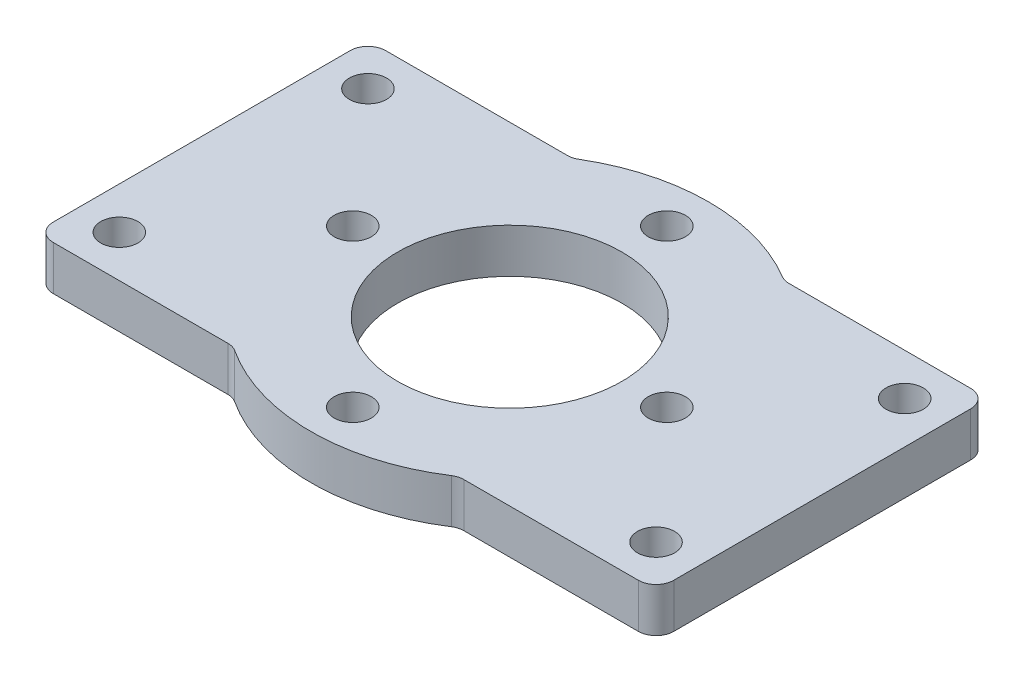
ISO-10303-21;
HEADER;
FILE_DESCRIPTION(('STEP AP214'),'2;1');
FILE_NAME('part.step','',(''),(''),'','','');
FILE_SCHEMA(('AUTOMOTIVE_DESIGN { 1 0 10303 214 1 1 1 1 }'));
ENDSEC;
DATA;
#1=APPLICATION_CONTEXT('core data for automotive mechanical design processes');
#2=APPLICATION_PROTOCOL_DEFINITION('international standard','automotive_design',2000,#1);
#3=PRODUCT_CONTEXT('',#1,'mechanical');
#4=PRODUCT('Part','Part','',(#3));
#5=PRODUCT_RELATED_PRODUCT_CATEGORY('part','',(#4));
#6=PRODUCT_DEFINITION_FORMATION('','',#4);
#7=PRODUCT_DEFINITION_CONTEXT('part definition',#1,'design');
#8=PRODUCT_DEFINITION('design','',#6,#7);
#9=PRODUCT_DEFINITION_SHAPE('','',#8);
#10=(LENGTH_UNIT() NAMED_UNIT(*) SI_UNIT(.MILLI.,.METRE.));
#11=(NAMED_UNIT(*) PLANE_ANGLE_UNIT() SI_UNIT($,.RADIAN.));
#12=(NAMED_UNIT(*) SI_UNIT($,.STERADIAN.) SOLID_ANGLE_UNIT());
#13=UNCERTAINTY_MEASURE_WITH_UNIT(LENGTH_MEASURE(1.E-05),#10,'distance_accuracy_value','');
#14=(GEOMETRIC_REPRESENTATION_CONTEXT(3) GLOBAL_UNCERTAINTY_ASSIGNED_CONTEXT((#13)) GLOBAL_UNIT_ASSIGNED_CONTEXT((#10,
#11,#12)) REPRESENTATION_CONTEXT('',''));
#15=CARTESIAN_POINT('',(0.,0.,0.));
#16=DIRECTION('',(0.,0.,1.));
#17=DIRECTION('',(1.,0.,0.));
#18=AXIS2_PLACEMENT_3D('',#15,#16,#17);
#19=CARTESIAN_POINT('',(-16.9014903189038,6.35,26.035));
#20=DIRECTION('',(0.,-1.,0.));
#21=DIRECTION('',(0.,0.,-1.));
#22=AXIS2_PLACEMENT_3D('',#19,#20,#21);
#23=CYLINDRICAL_SURFACE('',#22,2.54);
#24=DIRECTION('',(0.,1.,0.));
#25=VECTOR('',#24,1.);
#26=CARTESIAN_POINT('',(-16.9014903189038,6.35,23.495));
#27=LINE('',#26,#25);
#28=CARTESIAN_POINT('',(-16.9014903189038,6.35,23.495));
#29=VERTEX_POINT('',#28);
#30=CARTESIAN_POINT('',(-16.9014903189038,0.,23.495));
#31=VERTEX_POINT('',#30);
#32=EDGE_CURVE('E142',#29,#31,#27,.F.);
#33=ORIENTED_EDGE('',*,*,#32,.T.);
#34=CARTESIAN_POINT('',(-16.9014903189038,0.,26.035));
#35=DIRECTION('',(0.,-1.,0.));
#36=DIRECTION('',(0.,0.,-1.));
#37=AXIS2_PLACEMENT_3D('',#34,#35,#36);
#38=CIRCLE('',#37,2.54);
#39=CARTESIAN_POINT('',(-15.5184431085296,0.,23.9045586340206));
#40=VERTEX_POINT('',#39);
#41=EDGE_CURVE('E20',#40,#31,#38,.F.);
#42=ORIENTED_EDGE('',*,*,#41,.F.);
#43=DIRECTION('',(0.,-1.,0.));
#44=VECTOR('',#43,1.);
#45=CARTESIAN_POINT('',(-15.5184431085296,6.35,23.9045586340206));
#46=LINE('',#45,#44);
#47=CARTESIAN_POINT('',(-15.5184431085296,6.35,23.9045586340206));
#48=VERTEX_POINT('',#47);
#49=EDGE_CURVE('E202',#48,#40,#46,.T.);
#50=ORIENTED_EDGE('',*,*,#49,.F.);
#51=CARTESIAN_POINT('',(-16.9014903189038,6.35,26.035));
#52=DIRECTION('',(0.,-1.,0.));
#53=DIRECTION('',(0.,0.,-1.));
#54=AXIS2_PLACEMENT_3D('',#51,#52,#53);
#55=CIRCLE('',#54,2.54);
#56=EDGE_CURVE('E143',#29,#48,#55,.T.);
#57=ORIENTED_EDGE('',*,*,#56,.F.);
#58=EDGE_LOOP('',(#33,#42,#50,#57));
#59=FACE_BOUND('',#58,.T.);
#60=ADVANCED_FACE('F17',(#59),#23,.F.);
#61=CARTESIAN_POINT('',(16.9014903189039,6.35,26.035));
#62=DIRECTION('',(0.,-1.,0.));
#63=DIRECTION('',(0.,0.,-1.));
#64=AXIS2_PLACEMENT_3D('',#61,#62,#63);
#65=CYLINDRICAL_SURFACE('',#64,2.54);
#66=DIRECTION('',(0.,-1.,0.));
#67=VECTOR('',#66,1.);
#68=CARTESIAN_POINT('',(15.5184431085296,6.35,23.9045586340206));
#69=LINE('',#68,#67);
#70=CARTESIAN_POINT('',(15.5184431085296,0.,23.9045586340206));
#71=VERTEX_POINT('',#70);
#72=CARTESIAN_POINT('',(15.5184431085296,6.35,23.9045586340206));
#73=VERTEX_POINT('',#72);
#74=EDGE_CURVE('E147',#71,#73,#69,.F.);
#75=ORIENTED_EDGE('',*,*,#74,.F.);
#76=CARTESIAN_POINT('',(16.9014903189039,0.,26.035));
#77=DIRECTION('',(0.,-1.,0.));
#78=DIRECTION('',(0.,0.,-1.));
#79=AXIS2_PLACEMENT_3D('',#76,#77,#78);
#80=CIRCLE('',#79,2.54);
#81=CARTESIAN_POINT('',(16.9014903189039,0.,23.495));
#82=VERTEX_POINT('',#81);
#83=EDGE_CURVE('E140',#82,#71,#80,.F.);
#84=ORIENTED_EDGE('',*,*,#83,.F.);
#85=DIRECTION('',(0.,1.,0.));
#86=VECTOR('',#85,1.);
#87=CARTESIAN_POINT('',(16.9014903189039,6.35,23.495));
#88=LINE('',#87,#86);
#89=CARTESIAN_POINT('',(16.9014903189039,6.35,23.495));
#90=VERTEX_POINT('',#89);
#91=EDGE_CURVE('E198',#82,#90,#88,.T.);
#92=ORIENTED_EDGE('',*,*,#91,.T.);
#93=CARTESIAN_POINT('',(16.9014903189039,6.35,26.035));
#94=DIRECTION('',(0.,-1.,0.));
#95=DIRECTION('',(0.,0.,-1.));
#96=AXIS2_PLACEMENT_3D('',#93,#94,#95);
#97=CIRCLE('',#96,2.54);
#98=EDGE_CURVE('E297',#73,#90,#97,.T.);
#99=ORIENTED_EDGE('',*,*,#98,.F.);
#100=EDGE_LOOP('',(#75,#84,#92,#99));
#101=FACE_BOUND('',#100,.T.);
#102=ADVANCED_FACE('F311',(#101),#65,.F.);
#103=CARTESIAN_POINT('',(15.8805761860205,6.35,-26.67));
#104=DIRECTION('',(0.,-1.,0.));
#105=DIRECTION('',(0.,0.,-1.));
#106=AXIS2_PLACEMENT_3D('',#103,#104,#105);
#107=CYLINDRICAL_SURFACE('',#106,2.54);
#108=DIRECTION('',(0.,1.,0.));
#109=VECTOR('',#108,1.);
#110=CARTESIAN_POINT('',(15.8805761860205,6.35,-24.13));
#111=LINE('',#110,#109);
#112=CARTESIAN_POINT('',(15.8805761860205,6.35,-24.13));
#113=VERTEX_POINT('',#112);
#114=CARTESIAN_POINT('',(15.8805761860205,0.,-24.13));
#115=VERTEX_POINT('',#114);
#116=EDGE_CURVE('E181',#113,#115,#111,.F.);
#117=ORIENTED_EDGE('',*,*,#116,.T.);
#118=CARTESIAN_POINT('',(15.8805761860205,0.,-26.67));
#119=DIRECTION('',(0.,-1.,0.));
#120=DIRECTION('',(0.,0.,-1.));
#121=AXIS2_PLACEMENT_3D('',#118,#119,#120);
#122=CIRCLE('',#121,2.54);
#123=CARTESIAN_POINT('',(14.5810702738912,0.,-24.4875966494845));
#124=VERTEX_POINT('',#123);
#125=EDGE_CURVE('E303',#124,#115,#122,.F.);
#126=ORIENTED_EDGE('',*,*,#125,.F.);
#127=DIRECTION('',(0.,-1.,0.));
#128=VECTOR('',#127,1.);
#129=CARTESIAN_POINT('',(14.5810702738912,6.35,-24.4875966494845));
#130=LINE('',#129,#128);
#131=CARTESIAN_POINT('',(14.5810702738912,6.35,-24.4875966494845));
#132=VERTEX_POINT('',#131);
#133=EDGE_CURVE('E178',#132,#124,#130,.T.);
#134=ORIENTED_EDGE('',*,*,#133,.F.);
#135=CARTESIAN_POINT('',(15.8805761860205,6.35,-26.67));
#136=DIRECTION('',(0.,-1.,0.));
#137=DIRECTION('',(0.,0.,-1.));
#138=AXIS2_PLACEMENT_3D('',#135,#136,#137);
#139=CIRCLE('',#138,2.54);
#140=EDGE_CURVE('E294',#113,#132,#139,.T.);
#141=ORIENTED_EDGE('',*,*,#140,.F.);
#142=EDGE_LOOP('',(#117,#126,#134,#141));
#143=FACE_BOUND('',#142,.T.);
#144=ADVANCED_FACE('F386',(#143),#107,.F.);
#145=CARTESIAN_POINT('',(-15.8805761860205,6.35,-26.67));
#146=DIRECTION('',(0.,-1.,0.));
#147=DIRECTION('',(0.,0.,-1.));
#148=AXIS2_PLACEMENT_3D('',#145,#146,#147);
#149=CYLINDRICAL_SURFACE('',#148,2.54);
#150=DIRECTION('',(0.,-1.,0.));
#151=VECTOR('',#150,1.);
#152=CARTESIAN_POINT('',(-14.5810702738912,6.35,-24.4875966494845));
#153=LINE('',#152,#151);
#154=CARTESIAN_POINT('',(-14.5810702738912,0.,-24.4875966494845));
#155=VERTEX_POINT('',#154);
#156=CARTESIAN_POINT('',(-14.5810702738912,6.35,-24.4875966494845));
#157=VERTEX_POINT('',#156);
#158=EDGE_CURVE('E174',#155,#157,#153,.F.);
#159=ORIENTED_EDGE('',*,*,#158,.F.);
#160=CARTESIAN_POINT('',(-15.8805761860205,0.,-26.67));
#161=DIRECTION('',(0.,-1.,0.));
#162=DIRECTION('',(0.,0.,-1.));
#163=AXIS2_PLACEMENT_3D('',#160,#161,#162);
#164=CIRCLE('',#163,2.54);
#165=CARTESIAN_POINT('',(-15.8805761860205,0.,-24.13));
#166=VERTEX_POINT('',#165);
#167=EDGE_CURVE('E300',#166,#155,#164,.F.);
#168=ORIENTED_EDGE('',*,*,#167,.F.);
#169=DIRECTION('',(0.,1.,0.));
#170=VECTOR('',#169,1.);
#171=CARTESIAN_POINT('',(-15.8805761860205,6.35,-24.13));
#172=LINE('',#171,#170);
#173=CARTESIAN_POINT('',(-15.8805761860205,6.35,-24.13));
#174=VERTEX_POINT('',#173);
#175=EDGE_CURVE('E170',#166,#174,#172,.T.);
#176=ORIENTED_EDGE('',*,*,#175,.T.);
#177=CARTESIAN_POINT('',(-15.8805761860205,6.35,-26.67));
#178=DIRECTION('',(0.,-1.,0.));
#179=DIRECTION('',(0.,0.,-1.));
#180=AXIS2_PLACEMENT_3D('',#177,#178,#179);
#181=CIRCLE('',#180,2.54);
#182=EDGE_CURVE('E292',#157,#174,#181,.T.);
#183=ORIENTED_EDGE('',*,*,#182,.F.);
#184=EDGE_LOOP('',(#159,#168,#176,#183));
#185=FACE_BOUND('',#184,.T.);
#186=ADVANCED_FACE('F384',(#185),#149,.F.);
#187=CARTESIAN_POINT('',(0.,6.35,0.));
#188=DIRECTION('',(0.,1.,0.));
#189=DIRECTION('',(0.,0.,1.));
#190=AXIS2_PLACEMENT_3D('',#187,#188,#189);
#191=PLANE('',#190);
#192=CARTESIAN_POINT('',(0.,6.35,0.));
#193=DIRECTION('',(0.,-1.,0.));
#194=DIRECTION('',(0.,0.,-1.));
#195=AXIS2_PLACEMENT_3D('',#192,#193,#194);
#196=CIRCLE('',#195,28.5);
#197=EDGE_CURVE('E177',#157,#132,#196,.T.);
#198=ORIENTED_EDGE('',*,*,#197,.F.);
#199=ORIENTED_EDGE('',*,*,#182,.T.);
#200=DIRECTION('',(1.,0.,0.));
#201=VECTOR('',#200,1.);
#202=CARTESIAN_POINT('',(-15.1655234001336,6.35,-24.13));
#203=LINE('',#202,#201);
#204=CARTESIAN_POINT('',(-41.91,6.35,-24.13));
#205=VERTEX_POINT('',#204);
#206=EDGE_CURVE('E173',#174,#205,#203,.F.);
#207=ORIENTED_EDGE('',*,*,#206,.T.);
#208=CARTESIAN_POINT('',(-41.91,6.35,-21.59));
#209=DIRECTION('',(0.,-1.,0.));
#210=DIRECTION('',(0.,0.,-1.));
#211=AXIS2_PLACEMENT_3D('',#208,#209,#210);
#212=CIRCLE('',#211,2.54);
#213=CARTESIAN_POINT('',(-44.45,6.35,-21.59));
#214=VERTEX_POINT('',#213);
#215=EDGE_CURVE('E169',#214,#205,#212,.T.);
#216=ORIENTED_EDGE('',*,*,#215,.F.);
#217=DIRECTION('',(0.,0.,-1.));
#218=VECTOR('',#217,1.);
#219=CARTESIAN_POINT('',(-44.45,6.35,-24.13));
#220=LINE('',#219,#218);
#221=CARTESIAN_POINT('',(-44.45,6.35,20.955));
#222=VERTEX_POINT('',#221);
#223=EDGE_CURVE('E163',#214,#222,#220,.F.);
#224=ORIENTED_EDGE('',*,*,#223,.T.);
#225=CARTESIAN_POINT('',(-41.91,6.35,20.955));
#226=DIRECTION('',(0.,-1.,0.));
#227=DIRECTION('',(0.,0.,-1.));
#228=AXIS2_PLACEMENT_3D('',#225,#226,#227);
#229=CIRCLE('',#228,2.54);
#230=CARTESIAN_POINT('',(-41.91,6.35,23.495));
#231=VERTEX_POINT('',#230);
#232=EDGE_CURVE('E206',#231,#222,#229,.T.);
#233=ORIENTED_EDGE('',*,*,#232,.F.);
#234=DIRECTION('',(-1.,0.,0.));
#235=VECTOR('',#234,1.);
#236=CARTESIAN_POINT('',(-16.13180011654,6.35,23.495));
#237=LINE('',#236,#235);
#238=EDGE_CURVE('E148',#231,#29,#237,.F.);
#239=ORIENTED_EDGE('',*,*,#238,.T.);
#240=ORIENTED_EDGE('',*,*,#56,.T.);
#241=CARTESIAN_POINT('',(0.,6.35,0.));
#242=DIRECTION('',(0.,-1.,0.));
#243=DIRECTION('',(0.,0.,-1.));
#244=AXIS2_PLACEMENT_3D('',#241,#242,#243);
#245=CIRCLE('',#244,28.5);
#246=EDGE_CURVE('E204',#73,#48,#245,.T.);
#247=ORIENTED_EDGE('',*,*,#246,.F.);
#248=ORIENTED_EDGE('',*,*,#98,.T.);
#249=DIRECTION('',(-1.,0.,0.));
#250=VECTOR('',#249,1.);
#251=CARTESIAN_POINT('',(44.45,6.35,23.495));
#252=LINE('',#251,#250);
#253=CARTESIAN_POINT('',(41.91,6.35,23.495));
#254=VERTEX_POINT('',#253);
#255=EDGE_CURVE('E201',#90,#254,#252,.F.);
#256=ORIENTED_EDGE('',*,*,#255,.T.);
#257=CARTESIAN_POINT('',(41.91,6.35,20.955));
#258=DIRECTION('',(0.,-1.,0.));
#259=DIRECTION('',(0.,0.,-1.));
#260=AXIS2_PLACEMENT_3D('',#257,#258,#259);
#261=CIRCLE('',#260,2.54);
#262=CARTESIAN_POINT('',(44.45,6.35,20.955));
#263=VERTEX_POINT('',#262);
#264=EDGE_CURVE('E197',#263,#254,#261,.T.);
#265=ORIENTED_EDGE('',*,*,#264,.F.);
#266=DIRECTION('',(0.,0.,1.));
#267=VECTOR('',#266,1.);
#268=CARTESIAN_POINT('',(44.45,6.35,-24.13));
#269=LINE('',#268,#267);
#270=CARTESIAN_POINT('',(44.45,6.35,-21.59));
#271=VERTEX_POINT('',#270);
#272=EDGE_CURVE('E194',#263,#271,#269,.F.);
#273=ORIENTED_EDGE('',*,*,#272,.T.);
#274=CARTESIAN_POINT('',(41.91,6.35,-21.59));
#275=DIRECTION('',(0.,-1.,0.));
#276=DIRECTION('',(0.,0.,-1.));
#277=AXIS2_PLACEMENT_3D('',#274,#275,#276);
#278=CIRCLE('',#277,2.54);
#279=CARTESIAN_POINT('',(41.91,6.35,-24.13));
#280=VERTEX_POINT('',#279);
#281=EDGE_CURVE('E190',#280,#271,#278,.T.);
#282=ORIENTED_EDGE('',*,*,#281,.F.);
#283=DIRECTION('',(1.,0.,0.));
#284=VECTOR('',#283,1.);
#285=CARTESIAN_POINT('',(44.45,6.35,-24.13));
#286=LINE('',#285,#284);
#287=EDGE_CURVE('E185',#280,#113,#286,.F.);
#288=ORIENTED_EDGE('',*,*,#287,.T.);
#289=ORIENTED_EDGE('',*,*,#140,.T.);
#290=EDGE_LOOP('',(#198,#199,#207,#216,#224,#233,#239,#240,#247,#248,#256,#265,#273,#282,#288,#289));
#291=FACE_BOUND('',#290,.T.);
#292=CARTESIAN_POINT('',(0.,6.35,0.));
#293=DIRECTION('',(0.,1.,0.));
#294=DIRECTION('',(0.,0.,1.));
#295=AXIS2_PLACEMENT_3D('',#292,#293,#294);
#296=CIRCLE('',#295,16.0655);
#297=CARTESIAN_POINT('',(0.,6.35,16.0655));
#298=VERTEX_POINT('',#297);
#299=EDGE_CURVE('E265',#298,#298,#296,.F.);
#300=ORIENTED_EDGE('',*,*,#299,.T.);
#301=EDGE_LOOP('',(#300));
#302=FACE_BOUND('',#301,.T.);
#303=CARTESIAN_POINT('',(0.,6.35,-22.5));
#304=DIRECTION('',(0.,1.,0.));
#305=DIRECTION('',(0.,0.,1.));
#306=AXIS2_PLACEMENT_3D('',#303,#304,#305);
#307=CIRCLE('',#306,2.665);
#308=CARTESIAN_POINT('',(0.,6.35,-19.835));
#309=VERTEX_POINT('',#308);
#310=EDGE_CURVE('E268',#309,#309,#307,.F.);
#311=ORIENTED_EDGE('',*,*,#310,.T.);
#312=EDGE_LOOP('',(#311));
#313=FACE_BOUND('',#312,.T.);
#314=CARTESIAN_POINT('',(-22.4999999999994,6.35,6.3948846218409E-13));
#315=DIRECTION('',(0.,1.,0.));
#316=DIRECTION('',(0.,0.,1.));
#317=AXIS2_PLACEMENT_3D('',#314,#315,#316);
#318=CIRCLE('',#317,2.66500000000102);
#319=CARTESIAN_POINT('',(-22.4999999999994,6.35,2.66500000000166));
#320=VERTEX_POINT('',#319);
#321=EDGE_CURVE('E271',#320,#320,#318,.F.);
#322=ORIENTED_EDGE('',*,*,#321,.T.);
#323=EDGE_LOOP('',(#322));
#324=FACE_BOUND('',#323,.T.);
#325=CARTESIAN_POINT('',(1.27346601377202E-12,6.35,22.5));
#326=DIRECTION('',(0.,1.,0.));
#327=DIRECTION('',(0.,0.,1.));
#328=AXIS2_PLACEMENT_3D('',#325,#326,#327);
#329=CIRCLE('',#328,2.66500000000137);
#330=CARTESIAN_POINT('',(1.27346601377202E-12,6.35,25.1650000000014));
#331=VERTEX_POINT('',#330);
#332=EDGE_CURVE('E274',#331,#331,#329,.F.);
#333=ORIENTED_EDGE('',*,*,#332,.T.);
#334=EDGE_LOOP('',(#333));
#335=FACE_BOUND('',#334,.T.);
#336=CARTESIAN_POINT('',(22.5000000000006,6.35,-6.36733006886009E-13));
#337=DIRECTION('',(0.,1.,0.));
#338=DIRECTION('',(0.,0.,1.));
#339=AXIS2_PLACEMENT_3D('',#336,#337,#338);
#340=CIRCLE('',#339,2.6650000000005);
#341=CARTESIAN_POINT('',(22.5000000000006,6.35,2.66499999999986));
#342=VERTEX_POINT('',#341);
#343=EDGE_CURVE('E277',#342,#342,#340,.F.);
#344=ORIENTED_EDGE('',*,*,#343,.T.);
#345=EDGE_LOOP('',(#344));
#346=FACE_BOUND('',#345,.T.);
#347=CARTESIAN_POINT('',(-38.45,6.35,-18.13));
#348=DIRECTION('',(0.,1.,0.));
#349=DIRECTION('',(0.,0.,1.));
#350=AXIS2_PLACEMENT_3D('',#347,#348,#349);
#351=CIRCLE('',#350,2.665);
#352=CARTESIAN_POINT('',(-38.45,6.35,-15.465));
#353=VERTEX_POINT('',#352);
#354=EDGE_CURVE('E280',#353,#353,#351,.F.);
#355=ORIENTED_EDGE('',*,*,#354,.T.);
#356=EDGE_LOOP('',(#355));
#357=FACE_BOUND('',#356,.T.);
#358=CARTESIAN_POINT('',(38.45,6.35,17.495));
#359=DIRECTION('',(0.,1.,0.));
#360=DIRECTION('',(0.,0.,1.));
#361=AXIS2_PLACEMENT_3D('',#358,#359,#360);
#362=CIRCLE('',#361,2.665);
#363=CARTESIAN_POINT('',(38.45,6.35,20.16));
#364=VERTEX_POINT('',#363);
#365=EDGE_CURVE('E283',#364,#364,#362,.F.);
#366=ORIENTED_EDGE('',*,*,#365,.T.);
#367=EDGE_LOOP('',(#366));
#368=FACE_BOUND('',#367,.T.);
#369=CARTESIAN_POINT('',(38.45,6.35,-18.13));
#370=DIRECTION('',(0.,1.,0.));
#371=DIRECTION('',(0.,0.,1.));
#372=AXIS2_PLACEMENT_3D('',#369,#370,#371);
#373=CIRCLE('',#372,2.665);
#374=CARTESIAN_POINT('',(38.45,6.35,-15.465));
#375=VERTEX_POINT('',#374);
#376=EDGE_CURVE('E286',#375,#375,#373,.F.);
#377=ORIENTED_EDGE('',*,*,#376,.T.);
#378=EDGE_LOOP('',(#377));
#379=FACE_BOUND('',#378,.T.);
#380=CARTESIAN_POINT('',(-38.45,6.35,17.495));
#381=DIRECTION('',(0.,1.,0.));
#382=DIRECTION('',(0.,0.,1.));
#383=AXIS2_PLACEMENT_3D('',#380,#381,#382);
#384=CIRCLE('',#383,2.665);
#385=CARTESIAN_POINT('',(-38.45,6.35,20.16));
#386=VERTEX_POINT('',#385);
#387=EDGE_CURVE('E289',#386,#386,#384,.F.);
#388=ORIENTED_EDGE('',*,*,#387,.T.);
#389=EDGE_LOOP('',(#388));
#390=FACE_BOUND('',#389,.T.);
#391=ADVANCED_FACE('F317',(#291,#302,#313,#324,#335,#346,#357,#368,#379,#390),#191,.T.);
#392=CARTESIAN_POINT('',(-38.45,-0.00100000000000013,17.495));
#393=DIRECTION('',(0.,1.,0.));
#394=DIRECTION('',(0.,0.,1.));
#395=AXIS2_PLACEMENT_3D('',#392,#393,#394);
#396=CYLINDRICAL_SURFACE('',#395,2.665);
#397=ORIENTED_EDGE('',*,*,#387,.F.);
#398=EDGE_LOOP('',(#397));
#399=FACE_BOUND('',#398,.T.);
#400=CARTESIAN_POINT('',(-38.45,0.,17.495));
#401=DIRECTION('',(0.,1.,0.));
#402=DIRECTION('',(0.,0.,1.));
#403=AXIS2_PLACEMENT_3D('',#400,#401,#402);
#404=CIRCLE('',#403,2.665);
#405=CARTESIAN_POINT('',(-38.45,0.,20.16));
#406=VERTEX_POINT('',#405);
#407=EDGE_CURVE('E210',#406,#406,#404,.F.);
#408=ORIENTED_EDGE('',*,*,#407,.T.);
#409=EDGE_LOOP('',(#408));
#410=FACE_BOUND('',#409,.T.);
#411=ADVANCED_FACE('F397',(#399,#410),#396,.F.);
#412=CARTESIAN_POINT('',(38.45,-0.00100000000000013,-18.13));
#413=DIRECTION('',(0.,1.,0.));
#414=DIRECTION('',(0.,0.,1.));
#415=AXIS2_PLACEMENT_3D('',#412,#413,#414);
#416=CYLINDRICAL_SURFACE('',#415,2.665);
#417=ORIENTED_EDGE('',*,*,#376,.F.);
#418=EDGE_LOOP('',(#417));
#419=FACE_BOUND('',#418,.T.);
#420=CARTESIAN_POINT('',(38.45,0.,-18.13));
#421=DIRECTION('',(0.,1.,0.));
#422=DIRECTION('',(0.,0.,1.));
#423=AXIS2_PLACEMENT_3D('',#420,#421,#422);
#424=CIRCLE('',#423,2.665);
#425=CARTESIAN_POINT('',(38.45,0.,-15.465));
#426=VERTEX_POINT('',#425);
#427=EDGE_CURVE('E253',#426,#426,#424,.F.);
#428=ORIENTED_EDGE('',*,*,#427,.T.);
#429=EDGE_LOOP('',(#428));
#430=FACE_BOUND('',#429,.T.);
#431=ADVANCED_FACE('F400',(#419,#430),#416,.F.);
#432=CARTESIAN_POINT('',(38.45,-0.00100000000000013,17.495));
#433=DIRECTION('',(0.,1.,0.));
#434=DIRECTION('',(0.,0.,1.));
#435=AXIS2_PLACEMENT_3D('',#432,#433,#434);
#436=CYLINDRICAL_SURFACE('',#435,2.665);
#437=ORIENTED_EDGE('',*,*,#365,.F.);
#438=EDGE_LOOP('',(#437));
#439=FACE_BOUND('',#438,.T.);
#440=CARTESIAN_POINT('',(38.45,0.,17.495));
#441=DIRECTION('',(0.,1.,0.));
#442=DIRECTION('',(0.,0.,1.));
#443=AXIS2_PLACEMENT_3D('',#440,#441,#442);
#444=CIRCLE('',#443,2.665);
#445=CARTESIAN_POINT('',(38.45,0.,20.16));
#446=VERTEX_POINT('',#445);
#447=EDGE_CURVE('E250',#446,#446,#444,.F.);
#448=ORIENTED_EDGE('',*,*,#447,.T.);
#449=EDGE_LOOP('',(#448));
#450=FACE_BOUND('',#449,.T.);
#451=ADVANCED_FACE('F404',(#439,#450),#436,.F.);
#452=CARTESIAN_POINT('',(-38.45,-0.00100000000000013,-18.13));
#453=DIRECTION('',(0.,1.,0.));
#454=DIRECTION('',(0.,0.,1.));
#455=AXIS2_PLACEMENT_3D('',#452,#453,#454);
#456=CYLINDRICAL_SURFACE('',#455,2.665);
#457=ORIENTED_EDGE('',*,*,#354,.F.);
#458=EDGE_LOOP('',(#457));
#459=FACE_BOUND('',#458,.T.);
#460=CARTESIAN_POINT('',(-38.45,0.,-18.13));
#461=DIRECTION('',(0.,1.,0.));
#462=DIRECTION('',(0.,0.,1.));
#463=AXIS2_PLACEMENT_3D('',#460,#461,#462);
#464=CIRCLE('',#463,2.665);
#465=CARTESIAN_POINT('',(-38.45,0.,-15.465));
#466=VERTEX_POINT('',#465);
#467=EDGE_CURVE('E247',#466,#466,#464,.F.);
#468=ORIENTED_EDGE('',*,*,#467,.T.);
#469=EDGE_LOOP('',(#468));
#470=FACE_BOUND('',#469,.T.);
#471=ADVANCED_FACE('F408',(#459,#470),#456,.F.);
#472=CARTESIAN_POINT('',(22.5000000000006,-0.00100000000000013,-6.36733006886009E-13));
#473=DIRECTION('',(0.,1.,0.));
#474=DIRECTION('',(0.,0.,1.));
#475=AXIS2_PLACEMENT_3D('',#472,#473,#474);
#476=CYLINDRICAL_SURFACE('',#475,2.6650000000005);
#477=ORIENTED_EDGE('',*,*,#343,.F.);
#478=EDGE_LOOP('',(#477));
#479=FACE_BOUND('',#478,.T.);
#480=CARTESIAN_POINT('',(22.5000000000006,0.,-6.36733006886009E-13));
#481=DIRECTION('',(0.,1.,0.));
#482=DIRECTION('',(0.,0.,1.));
#483=AXIS2_PLACEMENT_3D('',#480,#481,#482);
#484=CIRCLE('',#483,2.6650000000005);
#485=CARTESIAN_POINT('',(22.5000000000006,0.,2.66499999999986));
#486=VERTEX_POINT('',#485);
#487=EDGE_CURVE('E244',#486,#486,#484,.F.);
#488=ORIENTED_EDGE('',*,*,#487,.T.);
#489=EDGE_LOOP('',(#488));
#490=FACE_BOUND('',#489,.T.);
#491=ADVANCED_FACE('F412',(#479,#490),#476,.F.);
#492=CARTESIAN_POINT('',(1.27346601377202E-12,-0.00100000000000013,22.5));
#493=DIRECTION('',(0.,1.,0.));
#494=DIRECTION('',(0.,0.,1.));
#495=AXIS2_PLACEMENT_3D('',#492,#493,#494);
#496=CYLINDRICAL_SURFACE('',#495,2.66500000000137);
#497=ORIENTED_EDGE('',*,*,#332,.F.);
#498=EDGE_LOOP('',(#497));
#499=FACE_BOUND('',#498,.T.);
#500=CARTESIAN_POINT('',(1.27346601377202E-12,0.,22.5));
#501=DIRECTION('',(0.,1.,0.));
#502=DIRECTION('',(0.,0.,1.));
#503=AXIS2_PLACEMENT_3D('',#500,#501,#502);
#504=CIRCLE('',#503,2.66500000000137);
#505=CARTESIAN_POINT('',(1.27346601377202E-12,0.,25.1650000000014));
#506=VERTEX_POINT('',#505);
#507=EDGE_CURVE('E241',#506,#506,#504,.F.);
#508=ORIENTED_EDGE('',*,*,#507,.T.);
#509=EDGE_LOOP('',(#508));
#510=FACE_BOUND('',#509,.T.);
#511=ADVANCED_FACE('F416',(#499,#510),#496,.F.);
#512=CARTESIAN_POINT('',(-22.4999999999994,-0.00100000000000013,6.3948846218409E-13));
#513=DIRECTION('',(0.,1.,0.));
#514=DIRECTION('',(0.,0.,1.));
#515=AXIS2_PLACEMENT_3D('',#512,#513,#514);
#516=CYLINDRICAL_SURFACE('',#515,2.66500000000102);
#517=ORIENTED_EDGE('',*,*,#321,.F.);
#518=EDGE_LOOP('',(#517));
#519=FACE_BOUND('',#518,.T.);
#520=CARTESIAN_POINT('',(-22.4999999999994,0.,6.3948846218409E-13));
#521=DIRECTION('',(0.,1.,0.));
#522=DIRECTION('',(0.,0.,1.));
#523=AXIS2_PLACEMENT_3D('',#520,#521,#522);
#524=CIRCLE('',#523,2.66500000000102);
#525=CARTESIAN_POINT('',(-22.4999999999994,0.,2.66500000000166));
#526=VERTEX_POINT('',#525);
#527=EDGE_CURVE('E238',#526,#526,#524,.F.);
#528=ORIENTED_EDGE('',*,*,#527,.T.);
#529=EDGE_LOOP('',(#528));
#530=FACE_BOUND('',#529,.T.);
#531=ADVANCED_FACE('F420',(#519,#530),#516,.F.);
#532=CARTESIAN_POINT('',(0.,-0.00100000000000013,-22.5));
#533=DIRECTION('',(0.,1.,0.));
#534=DIRECTION('',(0.,0.,1.));
#535=AXIS2_PLACEMENT_3D('',#532,#533,#534);
#536=CYLINDRICAL_SURFACE('',#535,2.665);
#537=ORIENTED_EDGE('',*,*,#310,.F.);
#538=EDGE_LOOP('',(#537));
#539=FACE_BOUND('',#538,.T.);
#540=CARTESIAN_POINT('',(0.,0.,-22.5));
#541=DIRECTION('',(0.,1.,0.));
#542=DIRECTION('',(0.,0.,1.));
#543=AXIS2_PLACEMENT_3D('',#540,#541,#542);
#544=CIRCLE('',#543,2.665);
#545=CARTESIAN_POINT('',(0.,0.,-19.835));
#546=VERTEX_POINT('',#545);
#547=EDGE_CURVE('E235',#546,#546,#544,.F.);
#548=ORIENTED_EDGE('',*,*,#547,.T.);
#549=EDGE_LOOP('',(#548));
#550=FACE_BOUND('',#549,.T.);
#551=ADVANCED_FACE('F424',(#539,#550),#536,.F.);
#552=CARTESIAN_POINT('',(0.,-0.00100000000000013,0.));
#553=DIRECTION('',(0.,1.,0.));
#554=DIRECTION('',(0.,0.,1.));
#555=AXIS2_PLACEMENT_3D('',#552,#553,#554);
#556=CYLINDRICAL_SURFACE('',#555,16.0655);
#557=ORIENTED_EDGE('',*,*,#299,.F.);
#558=EDGE_LOOP('',(#557));
#559=FACE_BOUND('',#558,.T.);
#560=CARTESIAN_POINT('',(0.,0.,0.));
#561=DIRECTION('',(0.,1.,0.));
#562=DIRECTION('',(0.,0.,1.));
#563=AXIS2_PLACEMENT_3D('',#560,#561,#562);
#564=CIRCLE('',#563,16.0655);
#565=CARTESIAN_POINT('',(0.,0.,16.0655));
#566=VERTEX_POINT('',#565);
#567=EDGE_CURVE('E157',#566,#566,#564,.F.);
#568=ORIENTED_EDGE('',*,*,#567,.T.);
#569=EDGE_LOOP('',(#568));
#570=FACE_BOUND('',#569,.T.);
#571=ADVANCED_FACE('F428',(#559,#570),#556,.F.);
#572=CARTESIAN_POINT('',(-41.91,6.35,20.955));
#573=DIRECTION('',(0.,-1.,0.));
#574=DIRECTION('',(0.,0.,-1.));
#575=AXIS2_PLACEMENT_3D('',#572,#573,#574);
#576=CYLINDRICAL_SURFACE('',#575,2.54);
#577=CARTESIAN_POINT('',(-41.91,0.,20.955));
#578=DIRECTION('',(0.,-1.,0.));
#579=DIRECTION('',(0.,0.,-1.));
#580=AXIS2_PLACEMENT_3D('',#577,#578,#579);
#581=CIRCLE('',#580,2.54);
#582=CARTESIAN_POINT('',(-44.45,0.,20.955));
#583=VERTEX_POINT('',#582);
#584=CARTESIAN_POINT('',(-41.91,0.,23.495));
#585=VERTEX_POINT('',#584);
#586=EDGE_CURVE('E153',#583,#585,#581,.F.);
#587=ORIENTED_EDGE('',*,*,#586,.T.);
#588=DIRECTION('',(0.,1.,0.));
#589=VECTOR('',#588,1.);
#590=CARTESIAN_POINT('',(-41.91,6.35,23.495));
#591=LINE('',#590,#589);
#592=EDGE_CURVE('E152',#585,#231,#591,.T.);
#593=ORIENTED_EDGE('',*,*,#592,.T.);
#594=ORIENTED_EDGE('',*,*,#232,.T.);
#595=DIRECTION('',(0.,1.,0.));
#596=VECTOR('',#595,1.);
#597=CARTESIAN_POINT('',(-44.45,6.35,20.955));
#598=LINE('',#597,#596);
#599=EDGE_CURVE('E164',#222,#583,#598,.F.);
#600=ORIENTED_EDGE('',*,*,#599,.T.);
#601=EDGE_LOOP('',(#587,#593,#594,#600));
#602=FACE_BOUND('',#601,.T.);
#603=ADVANCED_FACE('F321',(#602),#576,.T.);
#604=CARTESIAN_POINT('',(-16.13180011654,6.35,23.495));
#605=DIRECTION('',(0.,0.,-1.));
#606=DIRECTION('',(-1.,0.,0.));
#607=AXIS2_PLACEMENT_3D('',#604,#605,#606);
#608=PLANE('',#607);
#609=ORIENTED_EDGE('',*,*,#32,.F.);
#610=ORIENTED_EDGE('',*,*,#238,.F.);
#611=ORIENTED_EDGE('',*,*,#592,.F.);
#612=DIRECTION('',(1.,0.,0.));
#613=VECTOR('',#612,1.);
#614=CARTESIAN_POINT('',(0.,0.,23.495));
#615=LINE('',#614,#613);
#616=EDGE_CURVE('E136',#585,#31,#615,.T.);
#617=ORIENTED_EDGE('',*,*,#616,.T.);
#618=EDGE_LOOP('',(#609,#610,#611,#617));
#619=FACE_BOUND('',#618,.T.);
#620=ADVANCED_FACE('F150',(#619),#608,.F.);
#621=CARTESIAN_POINT('',(0.,6.35,0.));
#622=DIRECTION('',(0.,-1.,0.));
#623=DIRECTION('',(0.,0.,-1.));
#624=AXIS2_PLACEMENT_3D('',#621,#622,#623);
#625=CYLINDRICAL_SURFACE('',#624,28.5);
#626=ORIENTED_EDGE('',*,*,#246,.T.);
#627=ORIENTED_EDGE('',*,*,#49,.T.);
#628=CARTESIAN_POINT('',(0.,0.,0.));
#629=DIRECTION('',(0.,-1.,0.));
#630=DIRECTION('',(0.,0.,-1.));
#631=AXIS2_PLACEMENT_3D('',#628,#629,#630);
#632=CIRCLE('',#631,28.5);
#633=EDGE_CURVE('E139',#40,#71,#632,.F.);
#634=ORIENTED_EDGE('',*,*,#633,.T.);
#635=ORIENTED_EDGE('',*,*,#74,.T.);
#636=EDGE_LOOP('',(#626,#627,#634,#635));
#637=FACE_BOUND('',#636,.T.);
#638=ADVANCED_FACE('F314',(#637),#625,.T.);
#639=CARTESIAN_POINT('',(44.45,6.35,23.495));
#640=DIRECTION('',(0.,0.,-1.));
#641=DIRECTION('',(-1.,0.,0.));
#642=AXIS2_PLACEMENT_3D('',#639,#640,#641);
#643=PLANE('',#642);
#644=DIRECTION('',(0.,-1.,0.));
#645=VECTOR('',#644,1.);
#646=CARTESIAN_POINT('',(41.91,6.35,23.495));
#647=LINE('',#646,#645);
#648=CARTESIAN_POINT('',(41.91,0.,23.495));
#649=VERTEX_POINT('',#648);
#650=EDGE_CURVE('E195',#254,#649,#647,.T.);
#651=ORIENTED_EDGE('',*,*,#650,.F.);
#652=ORIENTED_EDGE('',*,*,#255,.F.);
#653=ORIENTED_EDGE('',*,*,#91,.F.);
#654=DIRECTION('',(1.,0.,0.));
#655=VECTOR('',#654,1.);
#656=CARTESIAN_POINT('',(0.,0.,23.495));
#657=LINE('',#656,#655);
#658=EDGE_CURVE('E155',#82,#649,#657,.T.);
#659=ORIENTED_EDGE('',*,*,#658,.T.);
#660=EDGE_LOOP('',(#651,#652,#653,#659));
#661=FACE_BOUND('',#660,.T.);
#662=ADVANCED_FACE('F347',(#661),#643,.F.);
#663=CARTESIAN_POINT('',(41.91,6.35,20.955));
#664=DIRECTION('',(0.,-1.,0.));
#665=DIRECTION('',(0.,0.,-1.));
#666=AXIS2_PLACEMENT_3D('',#663,#664,#665);
#667=CYLINDRICAL_SURFACE('',#666,2.54);
#668=CARTESIAN_POINT('',(41.91,0.,20.955));
#669=DIRECTION('',(0.,-1.,0.));
#670=DIRECTION('',(0.,0.,-1.));
#671=AXIS2_PLACEMENT_3D('',#668,#669,#670);
#672=CIRCLE('',#671,2.54);
#673=CARTESIAN_POINT('',(44.45,0.,20.955));
#674=VERTEX_POINT('',#673);
#675=EDGE_CURVE('E230',#649,#674,#672,.F.);
#676=ORIENTED_EDGE('',*,*,#675,.T.);
#677=DIRECTION('',(0.,1.,0.));
#678=VECTOR('',#677,1.);
#679=CARTESIAN_POINT('',(44.45,6.35,20.955));
#680=LINE('',#679,#678);
#681=EDGE_CURVE('E191',#674,#263,#680,.T.);
#682=ORIENTED_EDGE('',*,*,#681,.T.);
#683=ORIENTED_EDGE('',*,*,#264,.T.);
#684=ORIENTED_EDGE('',*,*,#650,.T.);
#685=EDGE_LOOP('',(#676,#682,#683,#684));
#686=FACE_BOUND('',#685,.T.);
#687=ADVANCED_FACE('F344',(#686),#667,.T.);
#688=CARTESIAN_POINT('',(44.45,6.35,-24.13));
#689=DIRECTION('',(-1.,0.,0.));
#690=DIRECTION('',(0.,0.,1.));
#691=AXIS2_PLACEMENT_3D('',#688,#689,#690);
#692=PLANE('',#691);
#693=DIRECTION('',(0.,-1.,0.));
#694=VECTOR('',#693,1.);
#695=CARTESIAN_POINT('',(44.45,6.35,-21.59));
#696=LINE('',#695,#694);
#697=CARTESIAN_POINT('',(44.45,0.,-21.59));
#698=VERTEX_POINT('',#697);
#699=EDGE_CURVE('E186',#271,#698,#696,.T.);
#700=ORIENTED_EDGE('',*,*,#699,.F.);
#701=ORIENTED_EDGE('',*,*,#272,.F.);
#702=ORIENTED_EDGE('',*,*,#681,.F.);
#703=DIRECTION('',(0.,0.,1.));
#704=VECTOR('',#703,1.);
#705=CARTESIAN_POINT('',(44.45,0.,0.));
#706=LINE('',#705,#704);
#707=EDGE_CURVE('E229',#674,#698,#706,.F.);
#708=ORIENTED_EDGE('',*,*,#707,.T.);
#709=EDGE_LOOP('',(#700,#701,#702,#708));
#710=FACE_BOUND('',#709,.T.);
#711=ADVANCED_FACE('F339',(#710),#692,.F.);
#712=CARTESIAN_POINT('',(41.91,6.35,-21.59));
#713=DIRECTION('',(0.,-1.,0.));
#714=DIRECTION('',(0.,0.,-1.));
#715=AXIS2_PLACEMENT_3D('',#712,#713,#714);
#716=CYLINDRICAL_SURFACE('',#715,2.54);
#717=CARTESIAN_POINT('',(41.91,0.,-21.59));
#718=DIRECTION('',(0.,-1.,0.));
#719=DIRECTION('',(0.,0.,-1.));
#720=AXIS2_PLACEMENT_3D('',#717,#718,#719);
#721=CIRCLE('',#720,2.54);
#722=CARTESIAN_POINT('',(41.91,0.,-24.13));
#723=VERTEX_POINT('',#722);
#724=EDGE_CURVE('E226',#698,#723,#721,.F.);
#725=ORIENTED_EDGE('',*,*,#724,.T.);
#726=DIRECTION('',(0.,1.,0.));
#727=VECTOR('',#726,1.);
#728=CARTESIAN_POINT('',(41.91,6.35,-24.13));
#729=LINE('',#728,#727);
#730=EDGE_CURVE('E182',#723,#280,#729,.T.);
#731=ORIENTED_EDGE('',*,*,#730,.T.);
#732=ORIENTED_EDGE('',*,*,#281,.T.);
#733=ORIENTED_EDGE('',*,*,#699,.T.);
#734=EDGE_LOOP('',(#725,#731,#732,#733));
#735=FACE_BOUND('',#734,.T.);
#736=ADVANCED_FACE('F353',(#735),#716,.T.);
#737=CARTESIAN_POINT('',(44.45,6.35,-24.13));
#738=DIRECTION('',(0.,0.,1.));
#739=DIRECTION('',(1.,0.,0.));
#740=AXIS2_PLACEMENT_3D('',#737,#738,#739);
#741=PLANE('',#740);
#742=ORIENTED_EDGE('',*,*,#116,.F.);
#743=ORIENTED_EDGE('',*,*,#287,.F.);
#744=ORIENTED_EDGE('',*,*,#730,.F.);
#745=DIRECTION('',(1.,0.,0.));
#746=VECTOR('',#745,1.);
#747=CARTESIAN_POINT('',(0.,0.,-24.13));
#748=LINE('',#747,#746);
#749=EDGE_CURVE('E225',#723,#115,#748,.F.);
#750=ORIENTED_EDGE('',*,*,#749,.T.);
#751=EDGE_LOOP('',(#742,#743,#744,#750));
#752=FACE_BOUND('',#751,.T.);
#753=ADVANCED_FACE('F352',(#752),#741,.F.);
#754=CARTESIAN_POINT('',(0.,6.35,0.));
#755=DIRECTION('',(0.,-1.,0.));
#756=DIRECTION('',(0.,0.,-1.));
#757=AXIS2_PLACEMENT_3D('',#754,#755,#756);
#758=CYLINDRICAL_SURFACE('',#757,28.5);
#759=CARTESIAN_POINT('',(0.,0.,0.));
#760=DIRECTION('',(0.,-1.,0.));
#761=DIRECTION('',(0.,0.,-1.));
#762=AXIS2_PLACEMENT_3D('',#759,#760,#761);
#763=CIRCLE('',#762,28.5);
#764=EDGE_CURVE('E223',#124,#155,#763,.F.);
#765=ORIENTED_EDGE('',*,*,#764,.T.);
#766=ORIENTED_EDGE('',*,*,#158,.T.);
#767=ORIENTED_EDGE('',*,*,#197,.T.);
#768=ORIENTED_EDGE('',*,*,#133,.T.);
#769=EDGE_LOOP('',(#765,#766,#767,#768));
#770=FACE_BOUND('',#769,.T.);
#771=ADVANCED_FACE('F361',(#770),#758,.T.);
#772=CARTESIAN_POINT('',(-15.1655234001336,6.35,-24.13));
#773=DIRECTION('',(0.,0.,1.));
#774=DIRECTION('',(1.,0.,0.));
#775=AXIS2_PLACEMENT_3D('',#772,#773,#774);
#776=PLANE('',#775);
#777=DIRECTION('',(0.,-1.,0.));
#778=VECTOR('',#777,1.);
#779=CARTESIAN_POINT('',(-41.91,6.35,-24.13));
#780=LINE('',#779,#778);
#781=CARTESIAN_POINT('',(-41.91,0.,-24.13));
#782=VERTEX_POINT('',#781);
#783=EDGE_CURVE('E167',#205,#782,#780,.T.);
#784=ORIENTED_EDGE('',*,*,#783,.F.);
#785=ORIENTED_EDGE('',*,*,#206,.F.);
#786=ORIENTED_EDGE('',*,*,#175,.F.);
#787=DIRECTION('',(1.,0.,0.));
#788=VECTOR('',#787,1.);
#789=CARTESIAN_POINT('',(0.,0.,-24.13));
#790=LINE('',#789,#788);
#791=EDGE_CURVE('E222',#166,#782,#790,.F.);
#792=ORIENTED_EDGE('',*,*,#791,.T.);
#793=EDGE_LOOP('',(#784,#785,#786,#792));
#794=FACE_BOUND('',#793,.T.);
#795=ADVANCED_FACE('F330',(#794),#776,.F.);
#796=CARTESIAN_POINT('',(-41.91,6.35,-21.59));
#797=DIRECTION('',(0.,-1.,0.));
#798=DIRECTION('',(0.,0.,-1.));
#799=AXIS2_PLACEMENT_3D('',#796,#797,#798);
#800=CYLINDRICAL_SURFACE('',#799,2.54);
#801=CARTESIAN_POINT('',(-41.91,0.,-21.59));
#802=DIRECTION('',(0.,-1.,0.));
#803=DIRECTION('',(0.,0.,-1.));
#804=AXIS2_PLACEMENT_3D('',#801,#802,#803);
#805=CIRCLE('',#804,2.54);
#806=CARTESIAN_POINT('',(-44.45,0.,-21.59));
#807=VERTEX_POINT('',#806);
#808=EDGE_CURVE('E26',#782,#807,#805,.F.);
#809=ORIENTED_EDGE('',*,*,#808,.T.);
#810=DIRECTION('',(0.,1.,0.));
#811=VECTOR('',#810,1.);
#812=CARTESIAN_POINT('',(-44.45,6.35,-21.59));
#813=LINE('',#812,#811);
#814=EDGE_CURVE('E34',#807,#214,#813,.T.);
#815=ORIENTED_EDGE('',*,*,#814,.T.);
#816=ORIENTED_EDGE('',*,*,#215,.T.);
#817=ORIENTED_EDGE('',*,*,#783,.T.);
#818=EDGE_LOOP('',(#809,#815,#816,#817));
#819=FACE_BOUND('',#818,.T.);
#820=ADVANCED_FACE('F326',(#819),#800,.T.);
#821=CARTESIAN_POINT('',(-44.45,6.35,-24.13));
#822=DIRECTION('',(1.,0.,0.));
#823=DIRECTION('',(0.,0.,-1.));
#824=AXIS2_PLACEMENT_3D('',#821,#822,#823);
#825=PLANE('',#824);
#826=ORIENTED_EDGE('',*,*,#814,.F.);
#827=DIRECTION('',(0.,0.,1.));
#828=VECTOR('',#827,1.);
#829=CARTESIAN_POINT('',(-44.45,0.,0.));
#830=LINE('',#829,#828);
#831=EDGE_CURVE('E11',#807,#583,#830,.T.);
#832=ORIENTED_EDGE('',*,*,#831,.T.);
#833=ORIENTED_EDGE('',*,*,#599,.F.);
#834=ORIENTED_EDGE('',*,*,#223,.F.);
#835=EDGE_LOOP('',(#826,#832,#833,#834));
#836=FACE_BOUND('',#835,.T.);
#837=ADVANCED_FACE('F365',(#836),#825,.F.);
#838=CARTESIAN_POINT('',(0.,0.,0.));
#839=DIRECTION('',(0.,1.,0.));
#840=DIRECTION('',(0.,0.,1.));
#841=AXIS2_PLACEMENT_3D('',#838,#839,#840);
#842=PLANE('',#841);
#843=ORIENTED_EDGE('',*,*,#808,.F.);
#844=ORIENTED_EDGE('',*,*,#791,.F.);
#845=ORIENTED_EDGE('',*,*,#167,.T.);
#846=ORIENTED_EDGE('',*,*,#764,.F.);
#847=ORIENTED_EDGE('',*,*,#125,.T.);
#848=ORIENTED_EDGE('',*,*,#749,.F.);
#849=ORIENTED_EDGE('',*,*,#724,.F.);
#850=ORIENTED_EDGE('',*,*,#707,.F.);
#851=ORIENTED_EDGE('',*,*,#675,.F.);
#852=ORIENTED_EDGE('',*,*,#658,.F.);
#853=ORIENTED_EDGE('',*,*,#83,.T.);
#854=ORIENTED_EDGE('',*,*,#633,.F.);
#855=ORIENTED_EDGE('',*,*,#41,.T.);
#856=ORIENTED_EDGE('',*,*,#616,.F.);
#857=ORIENTED_EDGE('',*,*,#586,.F.);
#858=ORIENTED_EDGE('',*,*,#831,.F.);
#859=EDGE_LOOP('',(#843,#844,#845,#846,#847,#848,#849,#850,#851,#852,#853,#854,#855,#856,#857,#858));
#860=FACE_BOUND('',#859,.T.);
#861=ORIENTED_EDGE('',*,*,#567,.F.);
#862=EDGE_LOOP('',(#861));
#863=FACE_BOUND('',#862,.T.);
#864=ORIENTED_EDGE('',*,*,#547,.F.);
#865=EDGE_LOOP('',(#864));
#866=FACE_BOUND('',#865,.T.);
#867=ORIENTED_EDGE('',*,*,#527,.F.);
#868=EDGE_LOOP('',(#867));
#869=FACE_BOUND('',#868,.T.);
#870=ORIENTED_EDGE('',*,*,#507,.F.);
#871=EDGE_LOOP('',(#870));
#872=FACE_BOUND('',#871,.T.);
#873=ORIENTED_EDGE('',*,*,#487,.F.);
#874=EDGE_LOOP('',(#873));
#875=FACE_BOUND('',#874,.T.);
#876=ORIENTED_EDGE('',*,*,#467,.F.);
#877=EDGE_LOOP('',(#876));
#878=FACE_BOUND('',#877,.T.);
#879=ORIENTED_EDGE('',*,*,#447,.F.);
#880=EDGE_LOOP('',(#879));
#881=FACE_BOUND('',#880,.T.);
#882=ORIENTED_EDGE('',*,*,#427,.F.);
#883=EDGE_LOOP('',(#882));
#884=FACE_BOUND('',#883,.T.);
#885=ORIENTED_EDGE('',*,*,#407,.F.);
#886=EDGE_LOOP('',(#885));
#887=FACE_BOUND('',#886,.T.);
#888=ADVANCED_FACE('F133',(#860,#863,#866,#869,#872,#875,#878,#881,#884,#887),#842,.F.);
#889=CLOSED_SHELL('',(#60,#102,#144,#186,#391,#411,#431,#451,#471,#491,#511,#531,#551,#571,#603,
#620,#638,#662,#687,#711,#736,#753,#771,#795,#820,#837,#888));
#890=MANIFOLD_SOLID_BREP('B1',#889);
#891=ADVANCED_BREP_SHAPE_REPRESENTATION('',(#18,#890),#14);
#892=SHAPE_DEFINITION_REPRESENTATION(#9,#891);
ENDSEC;
END-ISO-10303-21;
